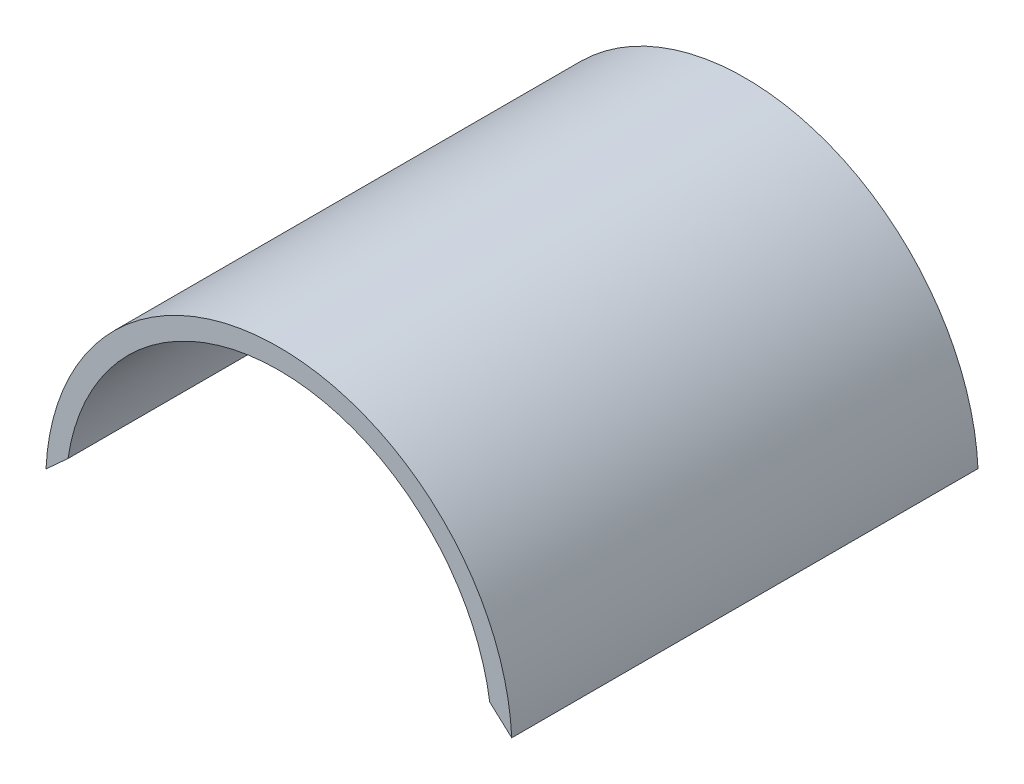
ISO-10303-21;
HEADER;
FILE_DESCRIPTION(('STEP AP214'),'2;1');
FILE_NAME('part.step','',(''),(''),'','','');
FILE_SCHEMA(('AUTOMOTIVE_DESIGN { 1 0 10303 214 1 1 1 1 }'));
ENDSEC;
DATA;
#1=APPLICATION_CONTEXT('core data for automotive mechanical design processes');
#2=APPLICATION_PROTOCOL_DEFINITION('international standard','automotive_design',2000,#1);
#3=PRODUCT_CONTEXT('',#1,'mechanical');
#4=PRODUCT('Part','Part','',(#3));
#5=PRODUCT_RELATED_PRODUCT_CATEGORY('part','',(#4));
#6=PRODUCT_DEFINITION_FORMATION('','',#4);
#7=PRODUCT_DEFINITION_CONTEXT('part definition',#1,'design');
#8=PRODUCT_DEFINITION('design','',#6,#7);
#9=PRODUCT_DEFINITION_SHAPE('','',#8);
#10=(LENGTH_UNIT() NAMED_UNIT(*) SI_UNIT(.MILLI.,.METRE.));
#11=(NAMED_UNIT(*) PLANE_ANGLE_UNIT() SI_UNIT($,.RADIAN.));
#12=(NAMED_UNIT(*) SI_UNIT($,.STERADIAN.) SOLID_ANGLE_UNIT());
#13=UNCERTAINTY_MEASURE_WITH_UNIT(LENGTH_MEASURE(1.E-05),#10,'distance_accuracy_value','');
#14=(GEOMETRIC_REPRESENTATION_CONTEXT(3) GLOBAL_UNCERTAINTY_ASSIGNED_CONTEXT((#13)) GLOBAL_UNIT_ASSIGNED_CONTEXT((#10,
#11,#12)) REPRESENTATION_CONTEXT('',''));
#15=CARTESIAN_POINT('',(0.,0.,0.));
#16=DIRECTION('',(0.,0.,1.));
#17=DIRECTION('',(1.,0.,0.));
#18=AXIS2_PLACEMENT_3D('',#15,#16,#17);
#19=CARTESIAN_POINT('',(0.,0.,88.9));
#20=DIRECTION('',(0.,0.,-1.));
#21=DIRECTION('',(-1.,0.,0.));
#22=AXIS2_PLACEMENT_3D('',#19,#20,#21);
#23=CYLINDRICAL_SURFACE('',#22,40.64);
#24=CARTESIAN_POINT('',(0.,0.,0.));
#25=DIRECTION('',(0.,0.,-1.));
#26=DIRECTION('',(1.,0.,0.));
#27=AXIS2_PLACEMENT_3D('',#24,#25,#26);
#28=CIRCLE('',#27,40.64);
#29=CARTESIAN_POINT('',(-40.2038837694651,5.93778829627168,0.));
#30=VERTEX_POINT('',#29);
#31=CARTESIAN_POINT('',(40.2038837694651,5.93778829627168,0.));
#32=VERTEX_POINT('',#31);
#33=EDGE_CURVE('E95',#30,#32,#28,.T.);
#34=ORIENTED_EDGE('',*,*,#33,.T.);
#35=DIRECTION('',(0.,0.,-1.));
#36=VECTOR('',#35,1.);
#37=CARTESIAN_POINT('',(40.2038837694651,5.93778829627168,88.9));
#38=LINE('',#37,#36);
#39=CARTESIAN_POINT('',(40.2038837694651,5.93778829627168,88.9));
#40=VERTEX_POINT('',#39);
#41=EDGE_CURVE('E11',#40,#32,#38,.T.);
#42=ORIENTED_EDGE('',*,*,#41,.F.);
#43=CARTESIAN_POINT('',(0.,0.,88.9));
#44=DIRECTION('',(0.,0.,-1.));
#45=DIRECTION('',(1.,0.,0.));
#46=AXIS2_PLACEMENT_3D('',#43,#44,#45);
#47=CIRCLE('',#46,40.64);
#48=CARTESIAN_POINT('',(-40.2038837694651,5.93778829627168,88.9));
#49=VERTEX_POINT('',#48);
#50=EDGE_CURVE('E83',#49,#40,#47,.T.);
#51=ORIENTED_EDGE('',*,*,#50,.F.);
#52=DIRECTION('',(0.,0.,-1.));
#53=VECTOR('',#52,1.);
#54=CARTESIAN_POINT('',(-40.2038837694651,5.93778829627168,88.9));
#55=LINE('',#54,#53);
#56=EDGE_CURVE('E91',#49,#30,#55,.T.);
#57=ORIENTED_EDGE('',*,*,#56,.T.);
#58=EDGE_LOOP('',(#34,#42,#51,#57));
#59=FACE_BOUND('',#58,.T.);
#60=ADVANCED_FACE('F32',(#59),#23,.F.);
#61=CARTESIAN_POINT('',(40.2038837694651,5.93778829627168,88.9));
#62=DIRECTION('',(0.672307408747508,0.740272077106257,0.));
#63=DIRECTION('',(-0.740272077106257,0.672307408747508,0.));
#64=AXIS2_PLACEMENT_3D('',#61,#62,#63);
#65=PLANE('',#64);
#66=DIRECTION('',(0.740272077106257,-0.672307408747507,0.));
#67=VECTOR('',#66,1.);
#68=CARTESIAN_POINT('',(40.2038837694651,5.93778829627168,0.));
#69=LINE('',#68,#67);
#70=CARTESIAN_POINT('',(44.39904297354,2.12778829627168,0.));
#71=VERTEX_POINT('',#70);
#72=EDGE_CURVE('E87',#32,#71,#69,.T.);
#73=ORIENTED_EDGE('',*,*,#72,.T.);
#74=DIRECTION('',(0.,0.,-1.));
#75=VECTOR('',#74,1.);
#76=CARTESIAN_POINT('',(44.39904297354,2.12778829627168,88.9));
#77=LINE('',#76,#75);
#78=CARTESIAN_POINT('',(44.39904297354,2.12778829627168,88.9));
#79=VERTEX_POINT('',#78);
#80=EDGE_CURVE('E40',#79,#71,#77,.T.);
#81=ORIENTED_EDGE('',*,*,#80,.F.);
#82=DIRECTION('',(0.740272077106257,-0.672307408747507,0.));
#83=VECTOR('',#82,1.);
#84=CARTESIAN_POINT('',(40.2038837694651,5.93778829627168,88.9));
#85=LINE('',#84,#83);
#86=EDGE_CURVE('E78',#40,#79,#85,.T.);
#87=ORIENTED_EDGE('',*,*,#86,.F.);
#88=ORIENTED_EDGE('',*,*,#41,.T.);
#89=EDGE_LOOP('',(#73,#81,#87,#88));
#90=FACE_BOUND('',#89,.T.);
#91=ADVANCED_FACE('F86',(#90),#65,.F.);
#92=CARTESIAN_POINT('',(0.,0.,88.9));
#93=DIRECTION('',(0.,0.,-1.));
#94=DIRECTION('',(-1.,0.,0.));
#95=AXIS2_PLACEMENT_3D('',#92,#93,#94);
#96=CYLINDRICAL_SURFACE('',#95,44.45);
#97=CARTESIAN_POINT('',(0.,0.,0.));
#98=DIRECTION('',(0.,0.,1.));
#99=DIRECTION('',(1.,0.,0.));
#100=AXIS2_PLACEMENT_3D('',#97,#98,#99);
#101=CIRCLE('',#100,44.45);
#102=CARTESIAN_POINT('',(-44.39904297354,2.12778829627168,0.));
#103=VERTEX_POINT('',#102);
#104=EDGE_CURVE('E65',#71,#103,#101,.T.);
#105=ORIENTED_EDGE('',*,*,#104,.T.);
#106=DIRECTION('',(0.,0.,-1.));
#107=VECTOR('',#106,1.);
#108=CARTESIAN_POINT('',(-44.39904297354,2.12778829627168,88.9));
#109=LINE('',#108,#107);
#110=CARTESIAN_POINT('',(-44.39904297354,2.12778829627168,88.9));
#111=VERTEX_POINT('',#110);
#112=EDGE_CURVE('E88',#111,#103,#109,.T.);
#113=ORIENTED_EDGE('',*,*,#112,.F.);
#114=CARTESIAN_POINT('',(0.,0.,88.9));
#115=DIRECTION('',(0.,0.,1.));
#116=DIRECTION('',(1.,0.,0.));
#117=AXIS2_PLACEMENT_3D('',#114,#115,#116);
#118=CIRCLE('',#117,44.45);
#119=EDGE_CURVE('E81',#79,#111,#118,.T.);
#120=ORIENTED_EDGE('',*,*,#119,.F.);
#121=ORIENTED_EDGE('',*,*,#80,.T.);
#122=EDGE_LOOP('',(#105,#113,#120,#121));
#123=FACE_BOUND('',#122,.T.);
#124=ADVANCED_FACE('F89',(#123),#96,.T.);
#125=CARTESIAN_POINT('',(-40.2038837694651,5.93778829627168,88.9));
#126=DIRECTION('',(-0.672307408747508,0.740272077106257,0.));
#127=DIRECTION('',(-0.740272077106257,-0.672307408747508,0.));
#128=AXIS2_PLACEMENT_3D('',#125,#126,#127);
#129=PLANE('',#128);
#130=DIRECTION('',(0.740272077106257,0.672307408747507,0.));
#131=VECTOR('',#130,1.);
#132=CARTESIAN_POINT('',(-40.2038837694651,5.93778829627168,0.));
#133=LINE('',#132,#131);
#134=EDGE_CURVE('E71',#103,#30,#133,.T.);
#135=ORIENTED_EDGE('',*,*,#134,.T.);
#136=ORIENTED_EDGE('',*,*,#56,.F.);
#137=DIRECTION('',(0.740272077106257,0.672307408747507,0.));
#138=VECTOR('',#137,1.);
#139=CARTESIAN_POINT('',(-40.2038837694651,5.93778829627168,88.9));
#140=LINE('',#139,#138);
#141=EDGE_CURVE('E48',#111,#49,#140,.T.);
#142=ORIENTED_EDGE('',*,*,#141,.F.);
#143=ORIENTED_EDGE('',*,*,#112,.T.);
#144=EDGE_LOOP('',(#135,#136,#142,#143));
#145=FACE_BOUND('',#144,.T.);
#146=ADVANCED_FACE('F102',(#145),#129,.F.);
#147=CARTESIAN_POINT('',(0.,0.,88.9));
#148=DIRECTION('',(0.,0.,1.));
#149=DIRECTION('',(1.,0.,0.));
#150=AXIS2_PLACEMENT_3D('',#147,#148,#149);
#151=PLANE('',#150);
#152=ORIENTED_EDGE('',*,*,#50,.T.);
#153=ORIENTED_EDGE('',*,*,#86,.T.);
#154=ORIENTED_EDGE('',*,*,#119,.T.);
#155=ORIENTED_EDGE('',*,*,#141,.T.);
#156=EDGE_LOOP('',(#152,#153,#154,#155));
#157=FACE_BOUND('',#156,.T.);
#158=ADVANCED_FACE('F79',(#157),#151,.T.);
#159=CARTESIAN_POINT('',(0.,0.,0.));
#160=DIRECTION('',(0.,0.,1.));
#161=DIRECTION('',(1.,0.,0.));
#162=AXIS2_PLACEMENT_3D('',#159,#160,#161);
#163=PLANE('',#162);
#164=ORIENTED_EDGE('',*,*,#33,.F.);
#165=ORIENTED_EDGE('',*,*,#134,.F.);
#166=ORIENTED_EDGE('',*,*,#104,.F.);
#167=ORIENTED_EDGE('',*,*,#72,.F.);
#168=EDGE_LOOP('',(#164,#165,#166,#167));
#169=FACE_BOUND('',#168,.T.);
#170=ADVANCED_FACE('F105',(#169),#163,.F.);
#171=CLOSED_SHELL('',(#60,#91,#124,#146,#158,#170));
#172=MANIFOLD_SOLID_BREP('B2',#171);
#173=ADVANCED_BREP_SHAPE_REPRESENTATION('',(#18,#172),#14);
#174=SHAPE_DEFINITION_REPRESENTATION(#9,#173);
ENDSEC;
END-ISO-10303-21;
